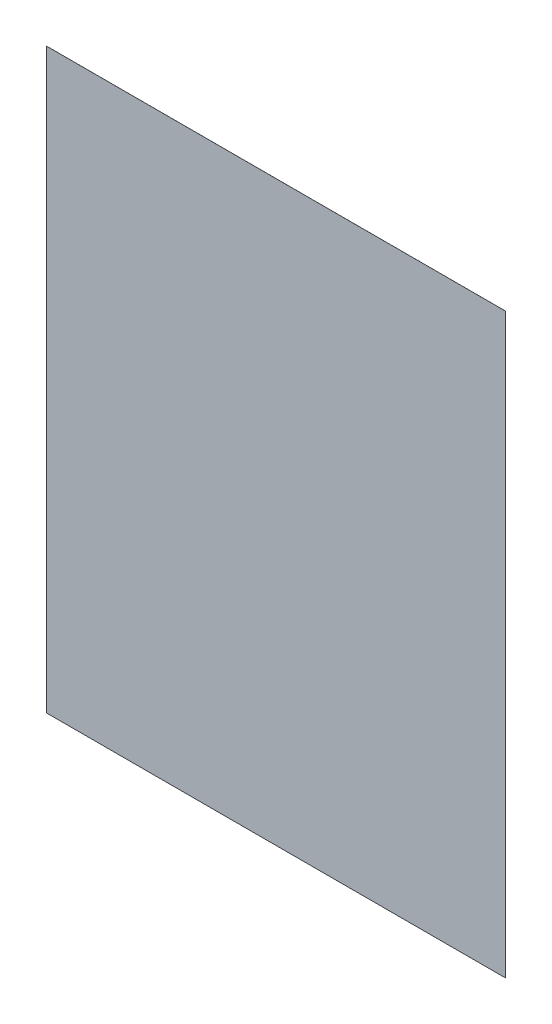
ISO-10303-21;
HEADER;
FILE_DESCRIPTION(('STEP AP214'),'2;1');
FILE_NAME('part.step','',(''),(''),'','','');
FILE_SCHEMA(('AUTOMOTIVE_DESIGN { 1 0 10303 214 1 1 1 1 }'));
ENDSEC;
DATA;
#1=APPLICATION_CONTEXT('core data for automotive mechanical design processes');
#2=APPLICATION_PROTOCOL_DEFINITION('international standard','automotive_design',2000,#1);
#3=PRODUCT_CONTEXT('',#1,'mechanical');
#4=PRODUCT('Part','Part','',(#3));
#5=PRODUCT_RELATED_PRODUCT_CATEGORY('part','',(#4));
#6=PRODUCT_DEFINITION_FORMATION('','',#4);
#7=PRODUCT_DEFINITION_CONTEXT('part definition',#1,'design');
#8=PRODUCT_DEFINITION('design','',#6,#7);
#9=PRODUCT_DEFINITION_SHAPE('','',#8);
#10=(LENGTH_UNIT() NAMED_UNIT(*) SI_UNIT(.MILLI.,.METRE.));
#11=(NAMED_UNIT(*) PLANE_ANGLE_UNIT() SI_UNIT($,.RADIAN.));
#12=(NAMED_UNIT(*) SI_UNIT($,.STERADIAN.) SOLID_ANGLE_UNIT());
#13=UNCERTAINTY_MEASURE_WITH_UNIT(LENGTH_MEASURE(1.E-05),#10,'distance_accuracy_value','');
#14=(GEOMETRIC_REPRESENTATION_CONTEXT(3) GLOBAL_UNCERTAINTY_ASSIGNED_CONTEXT((#13)) GLOBAL_UNIT_ASSIGNED_CONTEXT((#10,
#11,#12)) REPRESENTATION_CONTEXT('',''));
#15=CARTESIAN_POINT('',(0.,0.,0.));
#16=DIRECTION('',(0.,0.,1.));
#17=DIRECTION('',(1.,0.,0.));
#18=AXIS2_PLACEMENT_3D('',#15,#16,#17);
#19=CARTESIAN_POINT('',(-1.7526,2.1016,0.00025));
#20=DIRECTION('',(1.,0.,0.));
#21=DIRECTION('',(0.,0.,-1.));
#22=AXIS2_PLACEMENT_3D('',#19,#20,#21);
#23=PLANE('',#22);
#24=DIRECTION('',(0.,-1.,0.));
#25=VECTOR('',#24,1.);
#26=CARTESIAN_POINT('',(-1.7526,2.1016,0.));
#27=LINE('',#26,#25);
#28=CARTESIAN_POINT('',(-1.7526,2.1016,0.));
#29=VERTEX_POINT('',#28);
#30=CARTESIAN_POINT('',(-1.7526,-2.1016,0.));
#31=VERTEX_POINT('',#30);
#32=EDGE_CURVE('E97',#29,#31,#27,.T.);
#33=ORIENTED_EDGE('',*,*,#32,.T.);
#34=DIRECTION('',(0.,0.,-1.));
#35=VECTOR('',#34,1.);
#36=CARTESIAN_POINT('',(-1.7526,-2.1016,0.00025));
#37=LINE('',#36,#35);
#38=CARTESIAN_POINT('',(-1.7526,-2.1016,0.00025));
#39=VERTEX_POINT('',#38);
#40=EDGE_CURVE('E11',#39,#31,#37,.T.);
#41=ORIENTED_EDGE('',*,*,#40,.F.);
#42=DIRECTION('',(0.,-1.,0.));
#43=VECTOR('',#42,1.);
#44=CARTESIAN_POINT('',(-1.7526,2.1016,0.00025));
#45=LINE('',#44,#43);
#46=CARTESIAN_POINT('',(-1.7526,2.1016,0.00025));
#47=VERTEX_POINT('',#46);
#48=EDGE_CURVE('E85',#47,#39,#45,.T.);
#49=ORIENTED_EDGE('',*,*,#48,.F.);
#50=DIRECTION('',(0.,0.,-1.));
#51=VECTOR('',#50,1.);
#52=CARTESIAN_POINT('',(-1.7526,2.1016,0.00025));
#53=LINE('',#52,#51);
#54=EDGE_CURVE('E93',#47,#29,#53,.T.);
#55=ORIENTED_EDGE('',*,*,#54,.T.);
#56=EDGE_LOOP('',(#33,#41,#49,#55));
#57=FACE_BOUND('',#56,.T.);
#58=ADVANCED_FACE('F34',(#57),#23,.F.);
#59=CARTESIAN_POINT('',(-1.7526,-2.1016,0.00025));
#60=DIRECTION('',(0.,1.,0.));
#61=DIRECTION('',(0.,0.,1.));
#62=AXIS2_PLACEMENT_3D('',#59,#60,#61);
#63=PLANE('',#62);
#64=DIRECTION('',(1.,0.,0.));
#65=VECTOR('',#64,1.);
#66=CARTESIAN_POINT('',(-1.7526,-2.1016,0.));
#67=LINE('',#66,#65);
#68=CARTESIAN_POINT('',(1.5889,-2.1016,0.));
#69=VERTEX_POINT('',#68);
#70=EDGE_CURVE('E89',#31,#69,#67,.T.);
#71=ORIENTED_EDGE('',*,*,#70,.T.);
#72=DIRECTION('',(0.,0.,-1.));
#73=VECTOR('',#72,1.);
#74=CARTESIAN_POINT('',(1.5889,-2.1016,0.00025));
#75=LINE('',#74,#73);
#76=CARTESIAN_POINT('',(1.5889,-2.1016,0.00025));
#77=VERTEX_POINT('',#76);
#78=EDGE_CURVE('E42',#77,#69,#75,.T.);
#79=ORIENTED_EDGE('',*,*,#78,.F.);
#80=DIRECTION('',(1.,0.,0.));
#81=VECTOR('',#80,1.);
#82=CARTESIAN_POINT('',(-1.7526,-2.1016,0.00025));
#83=LINE('',#82,#81);
#84=EDGE_CURVE('E80',#39,#77,#83,.T.);
#85=ORIENTED_EDGE('',*,*,#84,.F.);
#86=ORIENTED_EDGE('',*,*,#40,.T.);
#87=EDGE_LOOP('',(#71,#79,#85,#86));
#88=FACE_BOUND('',#87,.T.);
#89=ADVANCED_FACE('F88',(#88),#63,.F.);
#90=CARTESIAN_POINT('',(1.5889,-2.1016,0.00025));
#91=DIRECTION('',(-1.,0.,0.));
#92=DIRECTION('',(0.,0.,1.));
#93=AXIS2_PLACEMENT_3D('',#90,#91,#92);
#94=PLANE('',#93);
#95=DIRECTION('',(0.,1.,0.));
#96=VECTOR('',#95,1.);
#97=CARTESIAN_POINT('',(1.5889,-2.1016,0.));
#98=LINE('',#97,#96);
#99=CARTESIAN_POINT('',(1.5889,2.1016,0.));
#100=VERTEX_POINT('',#99);
#101=EDGE_CURVE('E67',#69,#100,#98,.T.);
#102=ORIENTED_EDGE('',*,*,#101,.T.);
#103=DIRECTION('',(0.,0.,-1.));
#104=VECTOR('',#103,1.);
#105=CARTESIAN_POINT('',(1.5889,2.1016,0.00025));
#106=LINE('',#105,#104);
#107=CARTESIAN_POINT('',(1.5889,2.1016,0.00025));
#108=VERTEX_POINT('',#107);
#109=EDGE_CURVE('E90',#108,#100,#106,.T.);
#110=ORIENTED_EDGE('',*,*,#109,.F.);
#111=DIRECTION('',(0.,1.,0.));
#112=VECTOR('',#111,1.);
#113=CARTESIAN_POINT('',(1.5889,-2.1016,0.00025));
#114=LINE('',#113,#112);
#115=EDGE_CURVE('E83',#77,#108,#114,.T.);
#116=ORIENTED_EDGE('',*,*,#115,.F.);
#117=ORIENTED_EDGE('',*,*,#78,.T.);
#118=EDGE_LOOP('',(#102,#110,#116,#117));
#119=FACE_BOUND('',#118,.T.);
#120=ADVANCED_FACE('F91',(#119),#94,.F.);
#121=CARTESIAN_POINT('',(1.5889,2.1016,0.00025));
#122=DIRECTION('',(0.,-1.,0.));
#123=DIRECTION('',(0.,0.,-1.));
#124=AXIS2_PLACEMENT_3D('',#121,#122,#123);
#125=PLANE('',#124);
#126=DIRECTION('',(-1.,0.,0.));
#127=VECTOR('',#126,1.);
#128=CARTESIAN_POINT('',(1.5889,2.1016,0.));
#129=LINE('',#128,#127);
#130=EDGE_CURVE('E73',#100,#29,#129,.T.);
#131=ORIENTED_EDGE('',*,*,#130,.T.);
#132=ORIENTED_EDGE('',*,*,#54,.F.);
#133=DIRECTION('',(-1.,0.,0.));
#134=VECTOR('',#133,1.);
#135=CARTESIAN_POINT('',(1.5889,2.1016,0.00025));
#136=LINE('',#135,#134);
#137=EDGE_CURVE('E50',#108,#47,#136,.T.);
#138=ORIENTED_EDGE('',*,*,#137,.F.);
#139=ORIENTED_EDGE('',*,*,#109,.T.);
#140=EDGE_LOOP('',(#131,#132,#138,#139));
#141=FACE_BOUND('',#140,.T.);
#142=ADVANCED_FACE('F104',(#141),#125,.F.);
#143=CARTESIAN_POINT('',(0.,0.,0.00025));
#144=DIRECTION('',(0.,0.,1.));
#145=DIRECTION('',(1.,0.,0.));
#146=AXIS2_PLACEMENT_3D('',#143,#144,#145);
#147=PLANE('',#146);
#148=ORIENTED_EDGE('',*,*,#48,.T.);
#149=ORIENTED_EDGE('',*,*,#84,.T.);
#150=ORIENTED_EDGE('',*,*,#115,.T.);
#151=ORIENTED_EDGE('',*,*,#137,.T.);
#152=EDGE_LOOP('',(#148,#149,#150,#151));
#153=FACE_BOUND('',#152,.T.);
#154=ADVANCED_FACE('F81',(#153),#147,.T.);
#155=CARTESIAN_POINT('',(0.,0.,0.));
#156=DIRECTION('',(0.,0.,1.));
#157=DIRECTION('',(1.,0.,0.));
#158=AXIS2_PLACEMENT_3D('',#155,#156,#157);
#159=PLANE('',#158);
#160=ORIENTED_EDGE('',*,*,#32,.F.);
#161=ORIENTED_EDGE('',*,*,#130,.F.);
#162=ORIENTED_EDGE('',*,*,#101,.F.);
#163=ORIENTED_EDGE('',*,*,#70,.F.);
#164=EDGE_LOOP('',(#160,#161,#162,#163));
#165=FACE_BOUND('',#164,.T.);
#166=ADVANCED_FACE('F107',(#165),#159,.F.);
#167=CLOSED_SHELL('',(#58,#89,#120,#142,#154,#166));
#168=MANIFOLD_SOLID_BREP('B2',#167);
#169=ADVANCED_BREP_SHAPE_REPRESENTATION('',(#18,#168),#14);
#170=SHAPE_DEFINITION_REPRESENTATION(#9,#169);
ENDSEC;
END-ISO-10303-21;
